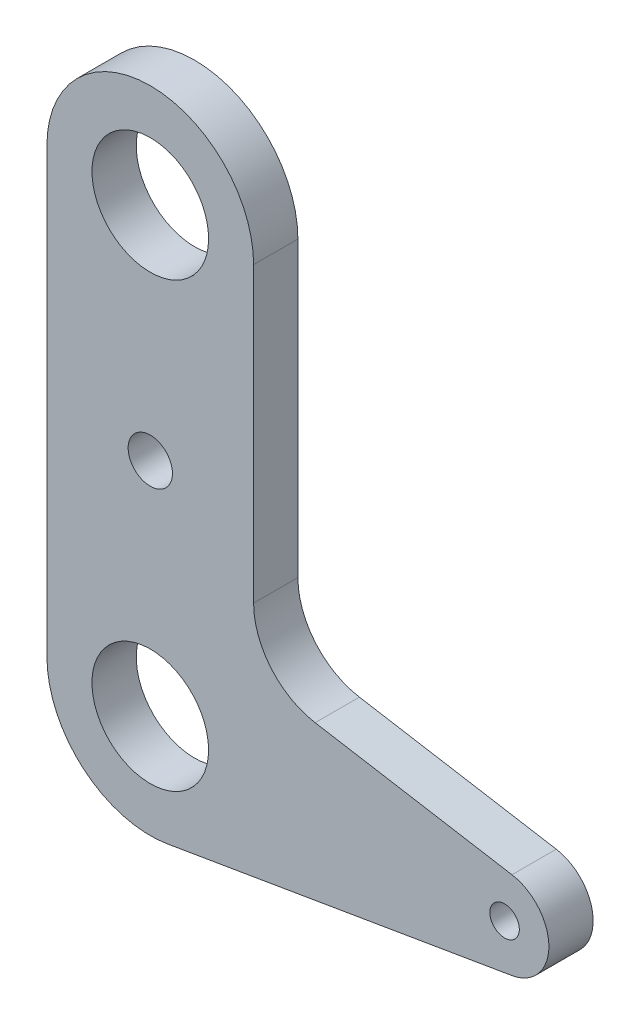
ISO-10303-21;
HEADER;
FILE_DESCRIPTION(('STEP AP214'),'2;1');
FILE_NAME('part.step','',(''),(''),'','','');
FILE_SCHEMA(('AUTOMOTIVE_DESIGN { 1 0 10303 214 1 1 1 1 }'));
ENDSEC;
DATA;
#1=APPLICATION_CONTEXT('core data for automotive mechanical design processes');
#2=APPLICATION_PROTOCOL_DEFINITION('international standard','automotive_design',2000,#1);
#3=PRODUCT_CONTEXT('',#1,'mechanical');
#4=PRODUCT('Part','Part','',(#3));
#5=PRODUCT_RELATED_PRODUCT_CATEGORY('part','',(#4));
#6=PRODUCT_DEFINITION_FORMATION('','',#4);
#7=PRODUCT_DEFINITION_CONTEXT('part definition',#1,'design');
#8=PRODUCT_DEFINITION('design','',#6,#7);
#9=PRODUCT_DEFINITION_SHAPE('','',#8);
#10=(LENGTH_UNIT() NAMED_UNIT(*) SI_UNIT(.MILLI.,.METRE.));
#11=(NAMED_UNIT(*) PLANE_ANGLE_UNIT() SI_UNIT($,.RADIAN.));
#12=(NAMED_UNIT(*) SI_UNIT($,.STERADIAN.) SOLID_ANGLE_UNIT());
#13=UNCERTAINTY_MEASURE_WITH_UNIT(LENGTH_MEASURE(1.E-05),#10,'distance_accuracy_value','');
#14=(GEOMETRIC_REPRESENTATION_CONTEXT(3) GLOBAL_UNCERTAINTY_ASSIGNED_CONTEXT((#13)) GLOBAL_UNIT_ASSIGNED_CONTEXT((#10,
#11,#12)) REPRESENTATION_CONTEXT('',''));
#15=CARTESIAN_POINT('',(0.,0.,0.));
#16=DIRECTION('',(0.,0.,1.));
#17=DIRECTION('',(1.,0.,0.));
#18=AXIS2_PLACEMENT_3D('',#15,#16,#17);
#19=CARTESIAN_POINT('',(-7.,0.,3.));
#20=DIRECTION('',(1.,0.,0.));
#21=DIRECTION('',(0.,1.,0.));
#22=AXIS2_PLACEMENT_3D('',#19,#20,#21);
#23=PLANE('',#22);
#24=DIRECTION('',(0.,-1.,0.));
#25=VECTOR('',#24,1.);
#26=CARTESIAN_POINT('',(-7.,0.,0.));
#27=LINE('',#26,#25);
#28=CARTESIAN_POINT('',(-7.,30.,0.));
#29=VERTEX_POINT('',#28);
#30=CARTESIAN_POINT('',(-7.,0.,0.));
#31=VERTEX_POINT('',#30);
#32=EDGE_CURVE('E126',#29,#31,#27,.T.);
#33=ORIENTED_EDGE('',*,*,#32,.T.);
#34=DIRECTION('',(0.,0.,-1.));
#35=VECTOR('',#34,1.);
#36=CARTESIAN_POINT('',(-7.,0.,3.));
#37=LINE('',#36,#35);
#38=CARTESIAN_POINT('',(-7.,0.,3.));
#39=VERTEX_POINT('',#38);
#40=EDGE_CURVE('E105',#39,#31,#37,.T.);
#41=ORIENTED_EDGE('',*,*,#40,.F.);
#42=DIRECTION('',(0.,-1.,0.));
#43=VECTOR('',#42,1.);
#44=CARTESIAN_POINT('',(-7.,0.,3.));
#45=LINE('',#44,#43);
#46=CARTESIAN_POINT('',(-7.,30.,3.));
#47=VERTEX_POINT('',#46);
#48=EDGE_CURVE('E112',#47,#39,#45,.T.);
#49=ORIENTED_EDGE('',*,*,#48,.F.);
#50=DIRECTION('',(0.,0.,-1.));
#51=VECTOR('',#50,1.);
#52=CARTESIAN_POINT('',(-7.,30.,3.));
#53=LINE('',#52,#51);
#54=EDGE_CURVE('E142',#47,#29,#53,.T.);
#55=ORIENTED_EDGE('',*,*,#54,.T.);
#56=EDGE_LOOP('',(#33,#41,#49,#55));
#57=FACE_BOUND('',#56,.T.);
#58=ADVANCED_FACE('F38',(#57),#23,.F.);
#59=CARTESIAN_POINT('',(0.,0.,3.));
#60=DIRECTION('',(0.,0.,-1.));
#61=DIRECTION('',(-1.,0.,0.));
#62=AXIS2_PLACEMENT_3D('',#59,#60,#61);
#63=CYLINDRICAL_SURFACE('',#62,7.);
#64=CARTESIAN_POINT('',(0.,0.,0.));
#65=DIRECTION('',(0.,0.,1.));
#66=DIRECTION('',(1.,0.,0.));
#67=AXIS2_PLACEMENT_3D('',#64,#65,#66);
#68=CIRCLE('',#67,7.);
#69=CARTESIAN_POINT('',(1.16666666666667,-6.90209308028288,0.));
#70=VERTEX_POINT('',#69);
#71=EDGE_CURVE('E165',#31,#70,#68,.T.);
#72=ORIENTED_EDGE('',*,*,#71,.T.);
#73=DIRECTION('',(0.,0.,-1.));
#74=VECTOR('',#73,1.);
#75=CARTESIAN_POINT('',(1.16666666666667,-6.90209308028288,3.));
#76=LINE('',#75,#74);
#77=CARTESIAN_POINT('',(1.16666666666667,-6.90209308028288,3.));
#78=VERTEX_POINT('',#77);
#79=EDGE_CURVE('E108',#78,#70,#76,.T.);
#80=ORIENTED_EDGE('',*,*,#79,.F.);
#81=CARTESIAN_POINT('',(0.,0.,3.));
#82=DIRECTION('',(0.,0.,1.));
#83=DIRECTION('',(1.,0.,0.));
#84=AXIS2_PLACEMENT_3D('',#81,#82,#83);
#85=CIRCLE('',#84,7.);
#86=EDGE_CURVE('E101',#39,#78,#85,.T.);
#87=ORIENTED_EDGE('',*,*,#86,.F.);
#88=ORIENTED_EDGE('',*,*,#40,.T.);
#89=EDGE_LOOP('',(#72,#80,#87,#88));
#90=FACE_BOUND('',#89,.T.);
#91=ADVANCED_FACE('F103',(#90),#63,.T.);
#92=CARTESIAN_POINT('',(1.16666666666666,-6.90209308028288,3.));
#93=DIRECTION('',(-0.166666666666666,0.986013297183269,0.));
#94=DIRECTION('',(-0.986013297183269,-0.166666666666666,0.));
#95=AXIS2_PLACEMENT_3D('',#92,#93,#94);
#96=PLANE('',#95);
#97=DIRECTION('',(0.986013297183269,0.166666666666666,0.));
#98=VECTOR('',#97,1.);
#99=CARTESIAN_POINT('',(1.16666666666666,-6.90209308028288,0.));
#100=LINE('',#99,#98);
#101=CARTESIAN_POINT('',(24.5,-2.95803989154981,0.));
#102=VERTEX_POINT('',#101);
#103=EDGE_CURVE('E163',#70,#102,#100,.T.);
#104=ORIENTED_EDGE('',*,*,#103,.T.);
#105=DIRECTION('',(0.,0.,-1.));
#106=VECTOR('',#105,1.);
#107=CARTESIAN_POINT('',(24.5,-2.95803989154981,3.));
#108=LINE('',#107,#106);
#109=CARTESIAN_POINT('',(24.5,-2.95803989154981,3.));
#110=VERTEX_POINT('',#109);
#111=EDGE_CURVE('E131',#110,#102,#108,.T.);
#112=ORIENTED_EDGE('',*,*,#111,.F.);
#113=DIRECTION('',(0.986013297183269,0.166666666666666,0.));
#114=VECTOR('',#113,1.);
#115=CARTESIAN_POINT('',(1.16666666666666,-6.90209308028288,3.));
#116=LINE('',#115,#114);
#117=EDGE_CURVE('E111',#78,#110,#116,.T.);
#118=ORIENTED_EDGE('',*,*,#117,.F.);
#119=ORIENTED_EDGE('',*,*,#79,.T.);
#120=EDGE_LOOP('',(#104,#112,#118,#119));
#121=FACE_BOUND('',#120,.T.);
#122=ADVANCED_FACE('F212',(#121),#96,.F.);
#123=CARTESIAN_POINT('',(24.,0.,3.));
#124=DIRECTION('',(0.,0.,-1.));
#125=DIRECTION('',(-1.,0.,0.));
#126=AXIS2_PLACEMENT_3D('',#123,#124,#125);
#127=CYLINDRICAL_SURFACE('',#126,3.);
#128=CARTESIAN_POINT('',(24.,0.,0.));
#129=DIRECTION('',(0.,0.,1.));
#130=DIRECTION('',(1.,0.,0.));
#131=AXIS2_PLACEMENT_3D('',#128,#129,#130);
#132=CIRCLE('',#131,3.);
#133=CARTESIAN_POINT('',(24.5,2.95803989154981,0.));
#134=VERTEX_POINT('',#133);
#135=EDGE_CURVE('E160',#102,#134,#132,.T.);
#136=ORIENTED_EDGE('',*,*,#135,.T.);
#137=DIRECTION('',(0.,0.,-1.));
#138=VECTOR('',#137,1.);
#139=CARTESIAN_POINT('',(24.5,2.95803989154981,3.));
#140=LINE('',#139,#138);
#141=CARTESIAN_POINT('',(24.5,2.95803989154981,3.));
#142=VERTEX_POINT('',#141);
#143=EDGE_CURVE('E137',#142,#134,#140,.T.);
#144=ORIENTED_EDGE('',*,*,#143,.F.);
#145=CARTESIAN_POINT('',(24.,0.,3.));
#146=DIRECTION('',(0.,0.,1.));
#147=DIRECTION('',(1.,0.,0.));
#148=AXIS2_PLACEMENT_3D('',#145,#146,#147);
#149=CIRCLE('',#148,3.);
#150=EDGE_CURVE('E185',#110,#142,#149,.T.);
#151=ORIENTED_EDGE('',*,*,#150,.F.);
#152=ORIENTED_EDGE('',*,*,#111,.T.);
#153=EDGE_LOOP('',(#136,#144,#151,#152));
#154=FACE_BOUND('',#153,.T.);
#155=ADVANCED_FACE('F238',(#154),#127,.T.);
#156=CARTESIAN_POINT('',(1.16666666666666,6.90209308028288,3.));
#157=DIRECTION('',(0.166666666666666,0.986013297183269,0.));
#158=DIRECTION('',(-0.986013297183269,0.166666666666666,0.));
#159=AXIS2_PLACEMENT_3D('',#156,#157,#158);
#160=PLANE('',#159);
#161=DIRECTION('',(0.986013297183269,-0.166666666666666,0.));
#162=VECTOR('',#161,1.);
#163=CARTESIAN_POINT('',(1.16666666666666,6.90209308028288,0.));
#164=LINE('',#163,#162);
#165=CARTESIAN_POINT('',(11.1666666666667,5.21178457082585,0.));
#166=VERTEX_POINT('',#165);
#167=EDGE_CURVE('E158',#166,#134,#164,.T.);
#168=ORIENTED_EDGE('',*,*,#167,.F.);
#169=DIRECTION('',(0.,0.,-1.));
#170=VECTOR('',#169,1.);
#171=CARTESIAN_POINT('',(11.1666666666667,5.21178457082585,3.));
#172=LINE('',#171,#170);
#173=CARTESIAN_POINT('',(11.1666666666667,5.21178457082585,3.));
#174=VERTEX_POINT('',#173);
#175=EDGE_CURVE('E53',#166,#174,#172,.F.);
#176=ORIENTED_EDGE('',*,*,#175,.T.);
#177=DIRECTION('',(0.986013297183269,-0.166666666666666,0.));
#178=VECTOR('',#177,1.);
#179=CARTESIAN_POINT('',(1.16666666666666,6.90209308028288,3.));
#180=LINE('',#179,#178);
#181=EDGE_CURVE('E183',#174,#142,#180,.T.);
#182=ORIENTED_EDGE('',*,*,#181,.T.);
#183=ORIENTED_EDGE('',*,*,#143,.T.);
#184=EDGE_LOOP('',(#168,#176,#182,#183));
#185=FACE_BOUND('',#184,.T.);
#186=ADVANCED_FACE('F234',(#185),#160,.T.);
#187=CARTESIAN_POINT('',(7.,0.,3.));
#188=DIRECTION('',(1.,0.,0.));
#189=DIRECTION('',(0.,1.,0.));
#190=AXIS2_PLACEMENT_3D('',#187,#188,#189);
#191=PLANE('',#190);
#192=DIRECTION('',(0.,-1.,0.));
#193=VECTOR('',#192,1.);
#194=CARTESIAN_POINT('',(7.,0.,3.));
#195=LINE('',#194,#193);
#196=CARTESIAN_POINT('',(7.,30.,3.));
#197=VERTEX_POINT('',#196);
#198=CARTESIAN_POINT('',(7.,10.1418510567422,3.));
#199=VERTEX_POINT('',#198);
#200=EDGE_CURVE('E180',#197,#199,#195,.T.);
#201=ORIENTED_EDGE('',*,*,#200,.T.);
#202=DIRECTION('',(0.,0.,-1.));
#203=VECTOR('',#202,1.);
#204=CARTESIAN_POINT('',(7.,10.1418510567422,0.));
#205=LINE('',#204,#203);
#206=CARTESIAN_POINT('',(7.,10.1418510567422,0.));
#207=VERTEX_POINT('',#206);
#208=EDGE_CURVE('E127',#199,#207,#205,.T.);
#209=ORIENTED_EDGE('',*,*,#208,.T.);
#210=DIRECTION('',(0.,-1.,0.));
#211=VECTOR('',#210,1.);
#212=CARTESIAN_POINT('',(7.,0.,0.));
#213=LINE('',#212,#211);
#214=CARTESIAN_POINT('',(7.,30.,0.));
#215=VERTEX_POINT('',#214);
#216=EDGE_CURVE('E156',#215,#207,#213,.T.);
#217=ORIENTED_EDGE('',*,*,#216,.F.);
#218=DIRECTION('',(0.,0.,-1.));
#219=VECTOR('',#218,1.);
#220=CARTESIAN_POINT('',(7.,30.,3.));
#221=LINE('',#220,#219);
#222=EDGE_CURVE('E140',#197,#215,#221,.T.);
#223=ORIENTED_EDGE('',*,*,#222,.F.);
#224=EDGE_LOOP('',(#201,#209,#217,#223));
#225=FACE_BOUND('',#224,.T.);
#226=ADVANCED_FACE('F231',(#225),#191,.T.);
#227=CARTESIAN_POINT('',(0.,0.,3.));
#228=DIRECTION('',(0.,0.,-1.));
#229=DIRECTION('',(-1.,0.,0.));
#230=AXIS2_PLACEMENT_3D('',#227,#228,#229);
#231=CYLINDRICAL_SURFACE('',#230,3.95);
#232=CARTESIAN_POINT('',(0.,0.,3.));
#233=DIRECTION('',(0.,0.,1.));
#234=DIRECTION('',(1.,0.,0.));
#235=AXIS2_PLACEMENT_3D('',#232,#233,#234);
#236=CIRCLE('',#235,3.95);
#237=CARTESIAN_POINT('',(3.95,0.,3.));
#238=VERTEX_POINT('',#237);
#239=EDGE_CURVE('E173',#238,#238,#236,.T.);
#240=ORIENTED_EDGE('',*,*,#239,.T.);
#241=EDGE_LOOP('',(#240));
#242=FACE_BOUND('',#241,.T.);
#243=CARTESIAN_POINT('',(0.,0.,0.));
#244=DIRECTION('',(0.,0.,1.));
#245=DIRECTION('',(1.,0.,0.));
#246=AXIS2_PLACEMENT_3D('',#243,#244,#245);
#247=CIRCLE('',#246,3.95);
#248=CARTESIAN_POINT('',(3.95,0.,0.));
#249=VERTEX_POINT('',#248);
#250=EDGE_CURVE('E148',#249,#249,#247,.T.);
#251=ORIENTED_EDGE('',*,*,#250,.F.);
#252=EDGE_LOOP('',(#251));
#253=FACE_BOUND('',#252,.T.);
#254=ADVANCED_FACE('F226',(#242,#253),#231,.F.);
#255=CARTESIAN_POINT('',(0.,30.,3.));
#256=DIRECTION('',(0.,0.,-1.));
#257=DIRECTION('',(-1.,0.,0.));
#258=AXIS2_PLACEMENT_3D('',#255,#256,#257);
#259=CYLINDRICAL_SURFACE('',#258,3.95);
#260=CARTESIAN_POINT('',(0.,30.,3.));
#261=DIRECTION('',(0.,0.,1.));
#262=DIRECTION('',(1.,0.,0.));
#263=AXIS2_PLACEMENT_3D('',#260,#261,#262);
#264=CIRCLE('',#263,3.95);
#265=CARTESIAN_POINT('',(3.95,30.,3.));
#266=VERTEX_POINT('',#265);
#267=EDGE_CURVE('E176',#266,#266,#264,.T.);
#268=ORIENTED_EDGE('',*,*,#267,.T.);
#269=EDGE_LOOP('',(#268));
#270=FACE_BOUND('',#269,.T.);
#271=CARTESIAN_POINT('',(0.,30.,0.));
#272=DIRECTION('',(0.,0.,1.));
#273=DIRECTION('',(1.,0.,0.));
#274=AXIS2_PLACEMENT_3D('',#271,#272,#273);
#275=CIRCLE('',#274,3.95);
#276=CARTESIAN_POINT('',(3.95,30.,0.));
#277=VERTEX_POINT('',#276);
#278=EDGE_CURVE('E151',#277,#277,#275,.T.);
#279=ORIENTED_EDGE('',*,*,#278,.F.);
#280=EDGE_LOOP('',(#279));
#281=FACE_BOUND('',#280,.T.);
#282=ADVANCED_FACE('F220',(#270,#281),#259,.F.);
#283=CARTESIAN_POINT('',(0.,30.,3.));
#284=DIRECTION('',(0.,0.,-1.));
#285=DIRECTION('',(-1.,0.,0.));
#286=AXIS2_PLACEMENT_3D('',#283,#284,#285);
#287=CYLINDRICAL_SURFACE('',#286,7.);
#288=CARTESIAN_POINT('',(0.,30.,0.));
#289=DIRECTION('',(0.,0.,1.));
#290=DIRECTION('',(1.,0.,0.));
#291=AXIS2_PLACEMENT_3D('',#288,#289,#290);
#292=CIRCLE('',#291,7.);
#293=EDGE_CURVE('E154',#215,#29,#292,.T.);
#294=ORIENTED_EDGE('',*,*,#293,.T.);
#295=ORIENTED_EDGE('',*,*,#54,.F.);
#296=CARTESIAN_POINT('',(0.,30.,3.));
#297=DIRECTION('',(0.,0.,1.));
#298=DIRECTION('',(1.,0.,0.));
#299=AXIS2_PLACEMENT_3D('',#296,#297,#298);
#300=CIRCLE('',#299,7.);
#301=EDGE_CURVE('E119',#197,#47,#300,.T.);
#302=ORIENTED_EDGE('',*,*,#301,.F.);
#303=ORIENTED_EDGE('',*,*,#222,.T.);
#304=EDGE_LOOP('',(#294,#295,#302,#303));
#305=FACE_BOUND('',#304,.T.);
#306=ADVANCED_FACE('F216',(#305),#287,.T.);
#307=CARTESIAN_POINT('',(0.,15.,3.));
#308=DIRECTION('',(0.,0.,-1.));
#309=DIRECTION('',(-1.,0.,0.));
#310=AXIS2_PLACEMENT_3D('',#307,#308,#309);
#311=CYLINDRICAL_SURFACE('',#310,1.5);
#312=CARTESIAN_POINT('',(0.,15.,3.));
#313=DIRECTION('',(0.,0.,1.));
#314=DIRECTION('',(1.,0.,0.));
#315=AXIS2_PLACEMENT_3D('',#312,#313,#314);
#316=CIRCLE('',#315,1.5);
#317=CARTESIAN_POINT('',(1.5,15.,3.));
#318=VERTEX_POINT('',#317);
#319=EDGE_CURVE('E123',#318,#318,#316,.T.);
#320=ORIENTED_EDGE('',*,*,#319,.T.);
#321=EDGE_LOOP('',(#320));
#322=FACE_BOUND('',#321,.T.);
#323=CARTESIAN_POINT('',(0.,15.,0.));
#324=DIRECTION('',(0.,0.,1.));
#325=DIRECTION('',(1.,0.,0.));
#326=AXIS2_PLACEMENT_3D('',#323,#324,#325);
#327=CIRCLE('',#326,1.5);
#328=CARTESIAN_POINT('',(1.5,15.,0.));
#329=VERTEX_POINT('',#328);
#330=EDGE_CURVE('E168',#329,#329,#327,.T.);
#331=ORIENTED_EDGE('',*,*,#330,.F.);
#332=EDGE_LOOP('',(#331));
#333=FACE_BOUND('',#332,.T.);
#334=ADVANCED_FACE('F192',(#322,#333),#311,.F.);
#335=CARTESIAN_POINT('',(24.,0.,3.));
#336=DIRECTION('',(0.,0.,-1.));
#337=DIRECTION('',(-1.,0.,0.));
#338=AXIS2_PLACEMENT_3D('',#335,#336,#337);
#339=CYLINDRICAL_SURFACE('',#338,1.);
#340=CARTESIAN_POINT('',(24.,0.,3.));
#341=DIRECTION('',(0.,0.,1.));
#342=DIRECTION('',(1.,0.,0.));
#343=AXIS2_PLACEMENT_3D('',#340,#341,#342);
#344=CIRCLE('',#343,1.);
#345=CARTESIAN_POINT('',(25.,0.,3.));
#346=VERTEX_POINT('',#345);
#347=EDGE_CURVE('E144',#346,#346,#344,.T.);
#348=ORIENTED_EDGE('',*,*,#347,.T.);
#349=EDGE_LOOP('',(#348));
#350=FACE_BOUND('',#349,.T.);
#351=CARTESIAN_POINT('',(24.,0.,0.));
#352=DIRECTION('',(0.,0.,1.));
#353=DIRECTION('',(1.,0.,0.));
#354=AXIS2_PLACEMENT_3D('',#351,#352,#353);
#355=CIRCLE('',#354,1.);
#356=CARTESIAN_POINT('',(25.,0.,0.));
#357=VERTEX_POINT('',#356);
#358=EDGE_CURVE('E145',#357,#357,#355,.T.);
#359=ORIENTED_EDGE('',*,*,#358,.F.);
#360=EDGE_LOOP('',(#359));
#361=FACE_BOUND('',#360,.T.);
#362=ADVANCED_FACE('F197',(#350,#361),#339,.F.);
#363=CARTESIAN_POINT('',(0.,0.,3.));
#364=DIRECTION('',(0.,0.,1.));
#365=DIRECTION('',(1.,0.,0.));
#366=AXIS2_PLACEMENT_3D('',#363,#364,#365);
#367=PLANE('',#366);
#368=ORIENTED_EDGE('',*,*,#319,.F.);
#369=EDGE_LOOP('',(#368));
#370=FACE_BOUND('',#369,.T.);
#371=ORIENTED_EDGE('',*,*,#48,.T.);
#372=ORIENTED_EDGE('',*,*,#86,.T.);
#373=ORIENTED_EDGE('',*,*,#117,.T.);
#374=ORIENTED_EDGE('',*,*,#150,.T.);
#375=ORIENTED_EDGE('',*,*,#181,.F.);
#376=CARTESIAN_POINT('',(12.,10.1418510567422,3.));
#377=DIRECTION('',(0.,0.,1.));
#378=DIRECTION('',(1.,0.,0.));
#379=AXIS2_PLACEMENT_3D('',#376,#377,#378);
#380=CIRCLE('',#379,5.);
#381=EDGE_CURVE('E11',#174,#199,#380,.F.);
#382=ORIENTED_EDGE('',*,*,#381,.T.);
#383=ORIENTED_EDGE('',*,*,#200,.F.);
#384=ORIENTED_EDGE('',*,*,#301,.T.);
#385=EDGE_LOOP('',(#371,#372,#373,#374,#375,#382,#383,#384));
#386=FACE_BOUND('',#385,.T.);
#387=ORIENTED_EDGE('',*,*,#267,.F.);
#388=EDGE_LOOP('',(#387));
#389=FACE_BOUND('',#388,.T.);
#390=ORIENTED_EDGE('',*,*,#239,.F.);
#391=EDGE_LOOP('',(#390));
#392=FACE_BOUND('',#391,.T.);
#393=ORIENTED_EDGE('',*,*,#347,.F.);
#394=EDGE_LOOP('',(#393));
#395=FACE_BOUND('',#394,.T.);
#396=ADVANCED_FACE('F115',(#370,#386,#389,#392,#395),#367,.T.);
#397=CARTESIAN_POINT('',(0.,0.,0.));
#398=DIRECTION('',(0.,0.,1.));
#399=DIRECTION('',(1.,0.,0.));
#400=AXIS2_PLACEMENT_3D('',#397,#398,#399);
#401=PLANE('',#400);
#402=ORIENTED_EDGE('',*,*,#330,.T.);
#403=EDGE_LOOP('',(#402));
#404=FACE_BOUND('',#403,.T.);
#405=ORIENTED_EDGE('',*,*,#32,.F.);
#406=ORIENTED_EDGE('',*,*,#293,.F.);
#407=ORIENTED_EDGE('',*,*,#216,.T.);
#408=CARTESIAN_POINT('',(12.,10.1418510567422,0.));
#409=DIRECTION('',(0.,0.,1.));
#410=DIRECTION('',(1.,0.,0.));
#411=AXIS2_PLACEMENT_3D('',#408,#409,#410);
#412=CIRCLE('',#411,5.);
#413=EDGE_CURVE('E46',#207,#166,#412,.T.);
#414=ORIENTED_EDGE('',*,*,#413,.T.);
#415=ORIENTED_EDGE('',*,*,#167,.T.);
#416=ORIENTED_EDGE('',*,*,#135,.F.);
#417=ORIENTED_EDGE('',*,*,#103,.F.);
#418=ORIENTED_EDGE('',*,*,#71,.F.);
#419=EDGE_LOOP('',(#405,#406,#407,#414,#415,#416,#417,#418));
#420=FACE_BOUND('',#419,.T.);
#421=ORIENTED_EDGE('',*,*,#278,.T.);
#422=EDGE_LOOP('',(#421));
#423=FACE_BOUND('',#422,.T.);
#424=ORIENTED_EDGE('',*,*,#250,.T.);
#425=EDGE_LOOP('',(#424));
#426=FACE_BOUND('',#425,.T.);
#427=ORIENTED_EDGE('',*,*,#358,.T.);
#428=EDGE_LOOP('',(#427));
#429=FACE_BOUND('',#428,.T.);
#430=ADVANCED_FACE('F196',(#404,#420,#423,#426,#429),#401,.F.);
#431=CARTESIAN_POINT('',(12.,10.1418510567422,3.));
#432=DIRECTION('',(0.,0.,1.));
#433=DIRECTION('',(1.,0.,0.));
#434=AXIS2_PLACEMENT_3D('',#431,#432,#433);
#435=CYLINDRICAL_SURFACE('',#434,5.);
#436=ORIENTED_EDGE('',*,*,#381,.F.);
#437=ORIENTED_EDGE('',*,*,#175,.F.);
#438=ORIENTED_EDGE('',*,*,#413,.F.);
#439=ORIENTED_EDGE('',*,*,#208,.F.);
#440=EDGE_LOOP('',(#436,#437,#438,#439));
#441=FACE_BOUND('',#440,.T.);
#442=ADVANCED_FACE('F40',(#441),#435,.F.);
#443=CLOSED_SHELL('',(#58,#91,#122,#155,#186,#226,#254,#282,#306,#334,#362,#396,#430,#442));
#444=MANIFOLD_SOLID_BREP('B2',#443);
#445=ADVANCED_BREP_SHAPE_REPRESENTATION('',(#18,#444),#14);
#446=SHAPE_DEFINITION_REPRESENTATION(#9,#445);
ENDSEC;
END-ISO-10303-21;
